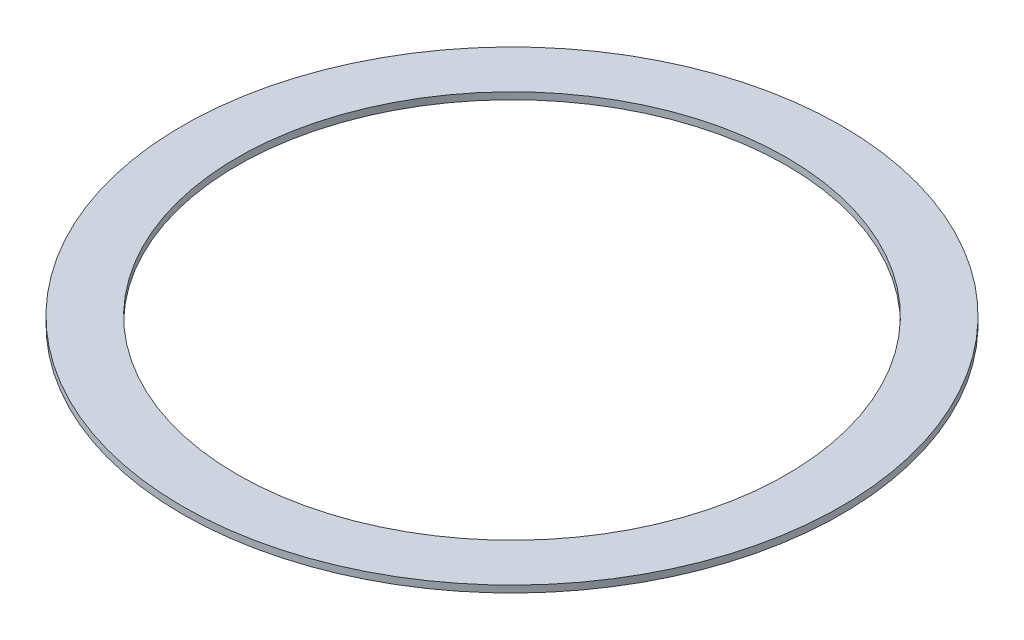
ISO-10303-21;
HEADER;
FILE_DESCRIPTION(('STEP AP214'),'2;1');
FILE_NAME('part.step','',(''),(''),'','','');
FILE_SCHEMA(('AUTOMOTIVE_DESIGN { 1 0 10303 214 1 1 1 1 }'));
ENDSEC;
DATA;
#1=APPLICATION_CONTEXT('core data for automotive mechanical design processes');
#2=APPLICATION_PROTOCOL_DEFINITION('international standard','automotive_design',2000,#1);
#3=PRODUCT_CONTEXT('',#1,'mechanical');
#4=PRODUCT('Part','Part','',(#3));
#5=PRODUCT_RELATED_PRODUCT_CATEGORY('part','',(#4));
#6=PRODUCT_DEFINITION_FORMATION('','',#4);
#7=PRODUCT_DEFINITION_CONTEXT('part definition',#1,'design');
#8=PRODUCT_DEFINITION('design','',#6,#7);
#9=PRODUCT_DEFINITION_SHAPE('','',#8);
#10=(LENGTH_UNIT() NAMED_UNIT(*) SI_UNIT(.MILLI.,.METRE.));
#11=(NAMED_UNIT(*) PLANE_ANGLE_UNIT() SI_UNIT($,.RADIAN.));
#12=(NAMED_UNIT(*) SI_UNIT($,.STERADIAN.) SOLID_ANGLE_UNIT());
#13=UNCERTAINTY_MEASURE_WITH_UNIT(LENGTH_MEASURE(1.E-05),#10,'distance_accuracy_value','');
#14=(GEOMETRIC_REPRESENTATION_CONTEXT(3) GLOBAL_UNCERTAINTY_ASSIGNED_CONTEXT((#13)) GLOBAL_UNIT_ASSIGNED_CONTEXT((#10,
#11,#12)) REPRESENTATION_CONTEXT('',''));
#15=CARTESIAN_POINT('',(0.,0.,0.));
#16=DIRECTION('',(0.,0.,1.));
#17=DIRECTION('',(1.,0.,0.));
#18=AXIS2_PLACEMENT_3D('',#15,#16,#17);
#19=CARTESIAN_POINT('',(0.,2.,0.));
#20=DIRECTION('',(0.,1.,0.));
#21=DIRECTION('',(0.,0.,1.));
#22=AXIS2_PLACEMENT_3D('',#19,#20,#21);
#23=PLANE('',#22);
#24=CARTESIAN_POINT('',(0.,2.,0.));
#25=DIRECTION('',(0.,1.,0.));
#26=DIRECTION('',(0.,0.,1.));
#27=AXIS2_PLACEMENT_3D('',#24,#25,#26);
#28=CIRCLE('',#27,96.);
#29=CARTESIAN_POINT('',(0.,2.,96.));
#30=VERTEX_POINT('',#29);
#31=EDGE_CURVE('E10',#30,#30,#28,.T.);
#32=ORIENTED_EDGE('',*,*,#31,.T.);
#33=EDGE_LOOP('',(#32));
#34=FACE_BOUND('',#33,.T.);
#35=CARTESIAN_POINT('',(0.,2.,0.));
#36=DIRECTION('',(0.,1.,0.));
#37=DIRECTION('',(0.,0.,1.));
#38=AXIS2_PLACEMENT_3D('',#35,#36,#37);
#39=CIRCLE('',#38,80.);
#40=CARTESIAN_POINT('',(0.,2.,80.));
#41=VERTEX_POINT('',#40);
#42=EDGE_CURVE('E51',#41,#41,#39,.T.);
#43=ORIENTED_EDGE('',*,*,#42,.F.);
#44=EDGE_LOOP('',(#43));
#45=FACE_BOUND('',#44,.T.);
#46=ADVANCED_FACE('F37',(#34,#45),#23,.T.);
#47=CARTESIAN_POINT('',(0.,0.,0.));
#48=DIRECTION('',(0.,1.,0.));
#49=DIRECTION('',(0.,0.,1.));
#50=AXIS2_PLACEMENT_3D('',#47,#48,#49);
#51=PLANE('',#50);
#52=CARTESIAN_POINT('',(0.,0.,0.));
#53=DIRECTION('',(0.,1.,0.));
#54=DIRECTION('',(0.,0.,1.));
#55=AXIS2_PLACEMENT_3D('',#52,#53,#54);
#56=CIRCLE('',#55,96.);
#57=CARTESIAN_POINT('',(0.,0.,96.));
#58=VERTEX_POINT('',#57);
#59=EDGE_CURVE('E41',#58,#58,#56,.T.);
#60=ORIENTED_EDGE('',*,*,#59,.F.);
#61=EDGE_LOOP('',(#60));
#62=FACE_BOUND('',#61,.T.);
#63=CARTESIAN_POINT('',(0.,0.,0.));
#64=DIRECTION('',(0.,1.,0.));
#65=DIRECTION('',(0.,0.,1.));
#66=AXIS2_PLACEMENT_3D('',#63,#64,#65);
#67=CIRCLE('',#66,80.);
#68=CARTESIAN_POINT('',(0.,0.,80.));
#69=VERTEX_POINT('',#68);
#70=EDGE_CURVE('E53',#69,#69,#67,.T.);
#71=ORIENTED_EDGE('',*,*,#70,.T.);
#72=EDGE_LOOP('',(#71));
#73=FACE_BOUND('',#72,.T.);
#74=ADVANCED_FACE('F64',(#62,#73),#51,.F.);
#75=CARTESIAN_POINT('',(0.,2.,0.));
#76=DIRECTION('',(0.,-1.,0.));
#77=DIRECTION('',(0.,0.,-1.));
#78=AXIS2_PLACEMENT_3D('',#75,#76,#77);
#79=CYLINDRICAL_SURFACE('',#78,96.);
#80=ORIENTED_EDGE('',*,*,#31,.F.);
#81=EDGE_LOOP('',(#80));
#82=FACE_BOUND('',#81,.T.);
#83=ORIENTED_EDGE('',*,*,#59,.T.);
#84=EDGE_LOOP('',(#83));
#85=FACE_BOUND('',#84,.T.);
#86=ADVANCED_FACE('F39',(#82,#85),#79,.T.);
#87=CARTESIAN_POINT('',(0.,2.,0.));
#88=DIRECTION('',(0.,-1.,0.));
#89=DIRECTION('',(0.,0.,-1.));
#90=AXIS2_PLACEMENT_3D('',#87,#88,#89);
#91=CYLINDRICAL_SURFACE('',#90,80.);
#92=ORIENTED_EDGE('',*,*,#42,.T.);
#93=EDGE_LOOP('',(#92));
#94=FACE_BOUND('',#93,.T.);
#95=ORIENTED_EDGE('',*,*,#70,.F.);
#96=EDGE_LOOP('',(#95));
#97=FACE_BOUND('',#96,.T.);
#98=ADVANCED_FACE('F60',(#94,#97),#91,.F.);
#99=CLOSED_SHELL('',(#46,#74,#86,#98));
#100=MANIFOLD_SOLID_BREP('B2',#99);
#101=ADVANCED_BREP_SHAPE_REPRESENTATION('',(#18,#100),#14);
#102=SHAPE_DEFINITION_REPRESENTATION(#9,#101);
ENDSEC;
END-ISO-10303-21;
